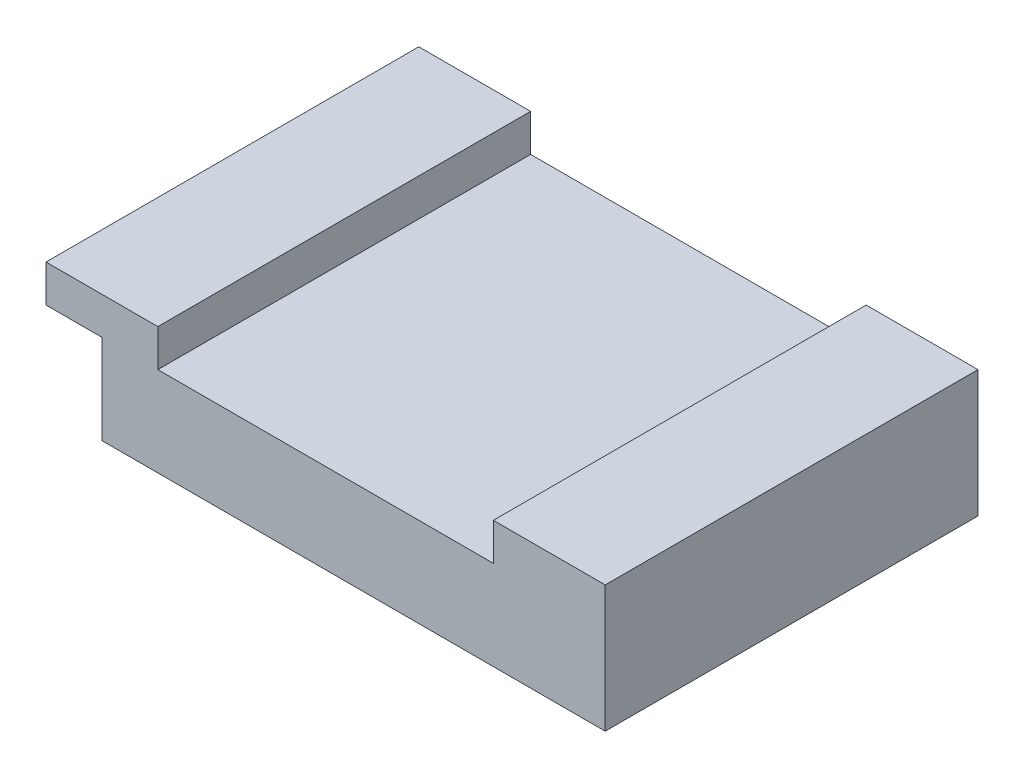
ISO-10303-21;
HEADER;
FILE_DESCRIPTION(('STEP AP214'),'2;1');
FILE_NAME('part.step','',(''),(''),'','','');
FILE_SCHEMA(('AUTOMOTIVE_DESIGN { 1 0 10303 214 1 1 1 1 }'));
ENDSEC;
DATA;
#1=APPLICATION_CONTEXT('core data for automotive mechanical design processes');
#2=APPLICATION_PROTOCOL_DEFINITION('international standard','automotive_design',2000,#1);
#3=PRODUCT_CONTEXT('',#1,'mechanical');
#4=PRODUCT('Part','Part','',(#3));
#5=PRODUCT_RELATED_PRODUCT_CATEGORY('part','',(#4));
#6=PRODUCT_DEFINITION_FORMATION('','',#4);
#7=PRODUCT_DEFINITION_CONTEXT('part definition',#1,'design');
#8=PRODUCT_DEFINITION('design','',#6,#7);
#9=PRODUCT_DEFINITION_SHAPE('','',#8);
#10=(LENGTH_UNIT() NAMED_UNIT(*) SI_UNIT(.MILLI.,.METRE.));
#11=(NAMED_UNIT(*) PLANE_ANGLE_UNIT() SI_UNIT($,.RADIAN.));
#12=(NAMED_UNIT(*) SI_UNIT($,.STERADIAN.) SOLID_ANGLE_UNIT());
#13=UNCERTAINTY_MEASURE_WITH_UNIT(LENGTH_MEASURE(1.E-05),#10,'distance_accuracy_value','');
#14=(GEOMETRIC_REPRESENTATION_CONTEXT(3) GLOBAL_UNCERTAINTY_ASSIGNED_CONTEXT((#13)) GLOBAL_UNIT_ASSIGNED_CONTEXT((#10,
#11,#12)) REPRESENTATION_CONTEXT('',''));
#15=CARTESIAN_POINT('',(0.,0.,0.));
#16=DIRECTION('',(0.,0.,1.));
#17=DIRECTION('',(1.,0.,0.));
#18=AXIS2_PLACEMENT_3D('',#15,#16,#17);
#19=CARTESIAN_POINT('',(75.,0.,50.));
#20=DIRECTION('',(0.,-1.,0.));
#21=DIRECTION('',(0.,0.,-1.));
#22=AXIS2_PLACEMENT_3D('',#19,#20,#21);
#23=PLANE('',#22);
#24=DIRECTION('',(0.,0.,1.));
#25=VECTOR('',#24,1.);
#26=CARTESIAN_POINT('',(60.,0.,0.));
#27=LINE('',#26,#25);
#28=CARTESIAN_POINT('',(60.,0.,0.));
#29=VERTEX_POINT('',#28);
#30=CARTESIAN_POINT('',(60.,0.,50.));
#31=VERTEX_POINT('',#30);
#32=EDGE_CURVE('E148',#29,#31,#27,.T.);
#33=ORIENTED_EDGE('',*,*,#32,.F.);
#34=DIRECTION('',(-1.,0.,0.));
#35=VECTOR('',#34,1.);
#36=CARTESIAN_POINT('',(75.,0.,0.));
#37=LINE('',#36,#35);
#38=CARTESIAN_POINT('',(15.,0.,0.));
#39=VERTEX_POINT('',#38);
#40=EDGE_CURVE('E55',#29,#39,#37,.T.);
#41=ORIENTED_EDGE('',*,*,#40,.T.);
#42=DIRECTION('',(0.,0.,1.));
#43=VECTOR('',#42,1.);
#44=CARTESIAN_POINT('',(15.,0.,50.));
#45=LINE('',#44,#43);
#46=CARTESIAN_POINT('',(15.,0.,50.));
#47=VERTEX_POINT('',#46);
#48=EDGE_CURVE('E163',#39,#47,#45,.T.);
#49=ORIENTED_EDGE('',*,*,#48,.T.);
#50=DIRECTION('',(-1.,0.,0.));
#51=VECTOR('',#50,1.);
#52=CARTESIAN_POINT('',(75.,0.,50.));
#53=LINE('',#52,#51);
#54=EDGE_CURVE('E131',#31,#47,#53,.T.);
#55=ORIENTED_EDGE('',*,*,#54,.F.);
#56=EDGE_LOOP('',(#33,#41,#49,#55));
#57=FACE_BOUND('',#56,.T.);
#58=ADVANCED_FACE('F39',(#57),#23,.F.);
#59=CARTESIAN_POINT('',(15.,0.,50.));
#60=DIRECTION('',(-1.,0.,0.));
#61=DIRECTION('',(0.,0.,1.));
#62=AXIS2_PLACEMENT_3D('',#59,#60,#61);
#63=PLANE('',#62);
#64=ORIENTED_EDGE('',*,*,#48,.F.);
#65=DIRECTION('',(0.,1.,0.));
#66=VECTOR('',#65,1.);
#67=CARTESIAN_POINT('',(15.,0.,0.));
#68=LINE('',#67,#66);
#69=CARTESIAN_POINT('',(15.,5.,0.));
#70=VERTEX_POINT('',#69);
#71=EDGE_CURVE('E216',#39,#70,#68,.T.);
#72=ORIENTED_EDGE('',*,*,#71,.T.);
#73=DIRECTION('',(0.,0.,-1.));
#74=VECTOR('',#73,1.);
#75=CARTESIAN_POINT('',(15.,5.,50.));
#76=LINE('',#75,#74);
#77=CARTESIAN_POINT('',(15.,5.,50.));
#78=VERTEX_POINT('',#77);
#79=EDGE_CURVE('E48',#78,#70,#76,.T.);
#80=ORIENTED_EDGE('',*,*,#79,.F.);
#81=DIRECTION('',(0.,1.,0.));
#82=VECTOR('',#81,1.);
#83=CARTESIAN_POINT('',(15.,0.,50.));
#84=LINE('',#83,#82);
#85=EDGE_CURVE('E203',#47,#78,#84,.T.);
#86=ORIENTED_EDGE('',*,*,#85,.F.);
#87=EDGE_LOOP('',(#64,#72,#80,#86));
#88=FACE_BOUND('',#87,.T.);
#89=ADVANCED_FACE('F241',(#88),#63,.F.);
#90=CARTESIAN_POINT('',(0.,0.,50.));
#91=DIRECTION('',(0.,1.,0.));
#92=DIRECTION('',(0.,0.,1.));
#93=AXIS2_PLACEMENT_3D('',#90,#91,#92);
#94=PLANE('',#93);
#95=DIRECTION('',(0.,0.,-1.));
#96=VECTOR('',#95,1.);
#97=CARTESIAN_POINT('',(7.49999999999999,0.,50.));
#98=LINE('',#97,#96);
#99=CARTESIAN_POINT('',(7.5,0.,50.));
#100=VERTEX_POINT('',#99);
#101=CARTESIAN_POINT('',(7.5,0.,0.));
#102=VERTEX_POINT('',#101);
#103=EDGE_CURVE('E63',#100,#102,#98,.T.);
#104=ORIENTED_EDGE('',*,*,#103,.F.);
#105=DIRECTION('',(1.,0.,0.));
#106=VECTOR('',#105,1.);
#107=CARTESIAN_POINT('',(0.,0.,50.));
#108=LINE('',#107,#106);
#109=CARTESIAN_POINT('',(0.,0.,50.));
#110=VERTEX_POINT('',#109);
#111=EDGE_CURVE('E199',#110,#100,#108,.T.);
#112=ORIENTED_EDGE('',*,*,#111,.F.);
#113=DIRECTION('',(0.,0.,-1.));
#114=VECTOR('',#113,1.);
#115=CARTESIAN_POINT('',(0.,0.,50.));
#116=LINE('',#115,#114);
#117=CARTESIAN_POINT('',(0.,0.,0.));
#118=VERTEX_POINT('',#117);
#119=EDGE_CURVE('E11',#110,#118,#116,.T.);
#120=ORIENTED_EDGE('',*,*,#119,.T.);
#121=DIRECTION('',(1.,0.,0.));
#122=VECTOR('',#121,1.);
#123=CARTESIAN_POINT('',(0.,0.,0.));
#124=LINE('',#123,#122);
#125=EDGE_CURVE('E213',#118,#102,#124,.T.);
#126=ORIENTED_EDGE('',*,*,#125,.T.);
#127=EDGE_LOOP('',(#104,#112,#120,#126));
#128=FACE_BOUND('',#127,.T.);
#129=ADVANCED_FACE('F265',(#128),#94,.F.);
#130=CARTESIAN_POINT('',(0.,0.,50.));
#131=DIRECTION('',(1.,0.,0.));
#132=DIRECTION('',(0.,0.,-1.));
#133=AXIS2_PLACEMENT_3D('',#130,#131,#132);
#134=PLANE('',#133);
#135=DIRECTION('',(0.,-1.,0.));
#136=VECTOR('',#135,1.);
#137=CARTESIAN_POINT('',(0.,0.,0.));
#138=LINE('',#137,#136);
#139=CARTESIAN_POINT('',(0.,5.,0.));
#140=VERTEX_POINT('',#139);
#141=EDGE_CURVE('E194',#140,#118,#138,.T.);
#142=ORIENTED_EDGE('',*,*,#141,.T.);
#143=ORIENTED_EDGE('',*,*,#119,.F.);
#144=DIRECTION('',(0.,-1.,0.));
#145=VECTOR('',#144,1.);
#146=CARTESIAN_POINT('',(0.,0.,50.));
#147=LINE('',#146,#145);
#148=CARTESIAN_POINT('',(0.,5.,50.));
#149=VERTEX_POINT('',#148);
#150=EDGE_CURVE('E195',#149,#110,#147,.T.);
#151=ORIENTED_EDGE('',*,*,#150,.F.);
#152=DIRECTION('',(0.,0.,-1.));
#153=VECTOR('',#152,1.);
#154=CARTESIAN_POINT('',(0.,5.,50.));
#155=LINE('',#154,#153);
#156=EDGE_CURVE('E209',#149,#140,#155,.T.);
#157=ORIENTED_EDGE('',*,*,#156,.T.);
#158=EDGE_LOOP('',(#142,#143,#151,#157));
#159=FACE_BOUND('',#158,.T.);
#160=ADVANCED_FACE('F41',(#159),#134,.F.);
#161=CARTESIAN_POINT('',(0.,5.,50.));
#162=DIRECTION('',(0.,-1.,0.));
#163=DIRECTION('',(0.,0.,-1.));
#164=AXIS2_PLACEMENT_3D('',#161,#162,#163);
#165=PLANE('',#164);
#166=DIRECTION('',(-1.,0.,0.));
#167=VECTOR('',#166,1.);
#168=CARTESIAN_POINT('',(0.,5.,0.));
#169=LINE('',#168,#167);
#170=EDGE_CURVE('E200',#70,#140,#169,.T.);
#171=ORIENTED_EDGE('',*,*,#170,.T.);
#172=ORIENTED_EDGE('',*,*,#156,.F.);
#173=DIRECTION('',(-1.,0.,0.));
#174=VECTOR('',#173,1.);
#175=CARTESIAN_POINT('',(0.,5.,50.));
#176=LINE('',#175,#174);
#177=EDGE_CURVE('E206',#78,#149,#176,.T.);
#178=ORIENTED_EDGE('',*,*,#177,.F.);
#179=ORIENTED_EDGE('',*,*,#79,.T.);
#180=EDGE_LOOP('',(#171,#172,#178,#179));
#181=FACE_BOUND('',#180,.T.);
#182=ADVANCED_FACE('F229',(#181),#165,.F.);
#183=CARTESIAN_POINT('',(0.,0.,50.));
#184=DIRECTION('',(0.,0.,-1.));
#185=DIRECTION('',(-1.,0.,0.));
#186=AXIS2_PLACEMENT_3D('',#183,#184,#185);
#187=PLANE('',#186);
#188=ORIENTED_EDGE('',*,*,#150,.T.);
#189=ORIENTED_EDGE('',*,*,#111,.T.);
#190=DIRECTION('',(0.,1.,0.));
#191=VECTOR('',#190,1.);
#192=CARTESIAN_POINT('',(7.49999999999999,-12.,50.));
#193=LINE('',#192,#191);
#194=CARTESIAN_POINT('',(7.49999999999999,-12.,50.));
#195=VERTEX_POINT('',#194);
#196=EDGE_CURVE('E190',#195,#100,#193,.T.);
#197=ORIENTED_EDGE('',*,*,#196,.F.);
#198=DIRECTION('',(-1.,0.,0.));
#199=VECTOR('',#198,1.);
#200=CARTESIAN_POINT('',(15.,-12.,50.));
#201=LINE('',#200,#199);
#202=CARTESIAN_POINT('',(75.,-12.,50.));
#203=VERTEX_POINT('',#202);
#204=EDGE_CURVE('E175',#203,#195,#201,.T.);
#205=ORIENTED_EDGE('',*,*,#204,.F.);
#206=DIRECTION('',(0.,-1.,0.));
#207=VECTOR('',#206,1.);
#208=CARTESIAN_POINT('',(75.,-12.,50.));
#209=LINE('',#208,#207);
#210=CARTESIAN_POINT('',(75.,5.,50.));
#211=VERTEX_POINT('',#210);
#212=EDGE_CURVE('E164',#211,#203,#209,.T.);
#213=ORIENTED_EDGE('',*,*,#212,.F.);
#214=DIRECTION('',(1.,0.,0.));
#215=VECTOR('',#214,1.);
#216=CARTESIAN_POINT('',(75.,5.,50.));
#217=LINE('',#216,#215);
#218=CARTESIAN_POINT('',(60.,5.,50.));
#219=VERTEX_POINT('',#218);
#220=EDGE_CURVE('E146',#219,#211,#217,.T.);
#221=ORIENTED_EDGE('',*,*,#220,.F.);
#222=DIRECTION('',(0.,-1.,0.));
#223=VECTOR('',#222,1.);
#224=CARTESIAN_POINT('',(60.,5.,50.));
#225=LINE('',#224,#223);
#226=EDGE_CURVE('E156',#219,#31,#225,.T.);
#227=ORIENTED_EDGE('',*,*,#226,.T.);
#228=ORIENTED_EDGE('',*,*,#54,.T.);
#229=ORIENTED_EDGE('',*,*,#85,.T.);
#230=ORIENTED_EDGE('',*,*,#177,.T.);
#231=EDGE_LOOP('',(#188,#189,#197,#205,#213,#221,#227,#228,#229,#230));
#232=FACE_BOUND('',#231,.T.);
#233=ADVANCED_FACE('F238',(#232),#187,.F.);
#234=CARTESIAN_POINT('',(0.,0.,0.));
#235=DIRECTION('',(0.,0.,-1.));
#236=DIRECTION('',(-1.,0.,0.));
#237=AXIS2_PLACEMENT_3D('',#234,#235,#236);
#238=PLANE('',#237);
#239=ORIENTED_EDGE('',*,*,#141,.F.);
#240=ORIENTED_EDGE('',*,*,#170,.F.);
#241=ORIENTED_EDGE('',*,*,#71,.F.);
#242=ORIENTED_EDGE('',*,*,#40,.F.);
#243=DIRECTION('',(0.,-1.,0.));
#244=VECTOR('',#243,1.);
#245=CARTESIAN_POINT('',(60.,5.,0.));
#246=LINE('',#245,#244);
#247=CARTESIAN_POINT('',(60.,5.,0.));
#248=VERTEX_POINT('',#247);
#249=EDGE_CURVE('E137',#248,#29,#246,.T.);
#250=ORIENTED_EDGE('',*,*,#249,.F.);
#251=DIRECTION('',(-1.,0.,0.));
#252=VECTOR('',#251,1.);
#253=CARTESIAN_POINT('',(75.,5.,0.));
#254=LINE('',#253,#252);
#255=CARTESIAN_POINT('',(75.,5.,0.));
#256=VERTEX_POINT('',#255);
#257=EDGE_CURVE('E134',#256,#248,#254,.T.);
#258=ORIENTED_EDGE('',*,*,#257,.F.);
#259=DIRECTION('',(0.,1.,0.));
#260=VECTOR('',#259,1.);
#261=CARTESIAN_POINT('',(75.,-12.,0.));
#262=LINE('',#261,#260);
#263=CARTESIAN_POINT('',(75.,-12.,0.));
#264=VERTEX_POINT('',#263);
#265=EDGE_CURVE('E120',#264,#256,#262,.T.);
#266=ORIENTED_EDGE('',*,*,#265,.F.);
#267=DIRECTION('',(1.,0.,0.));
#268=VECTOR('',#267,1.);
#269=CARTESIAN_POINT('',(15.,-12.,0.));
#270=LINE('',#269,#268);
#271=CARTESIAN_POINT('',(7.5,-12.,0.));
#272=VERTEX_POINT('',#271);
#273=EDGE_CURVE('E181',#272,#264,#270,.T.);
#274=ORIENTED_EDGE('',*,*,#273,.F.);
#275=DIRECTION('',(0.,1.,0.));
#276=VECTOR('',#275,1.);
#277=CARTESIAN_POINT('',(7.5,-12.,0.));
#278=LINE('',#277,#276);
#279=EDGE_CURVE('E184',#272,#102,#278,.T.);
#280=ORIENTED_EDGE('',*,*,#279,.T.);
#281=ORIENTED_EDGE('',*,*,#125,.F.);
#282=EDGE_LOOP('',(#239,#240,#241,#242,#250,#258,#266,#274,#280,#281));
#283=FACE_BOUND('',#282,.T.);
#284=ADVANCED_FACE('F136',(#283),#238,.T.);
#285=CARTESIAN_POINT('',(7.49999999999999,-12.,50.));
#286=DIRECTION('',(1.,0.,0.));
#287=DIRECTION('',(0.,0.,-1.));
#288=AXIS2_PLACEMENT_3D('',#285,#286,#287);
#289=PLANE('',#288);
#290=ORIENTED_EDGE('',*,*,#103,.T.);
#291=ORIENTED_EDGE('',*,*,#279,.F.);
#292=DIRECTION('',(0.,0.,-1.));
#293=VECTOR('',#292,1.);
#294=CARTESIAN_POINT('',(7.49999999999999,-12.,50.));
#295=LINE('',#294,#293);
#296=EDGE_CURVE('E178',#195,#272,#295,.T.);
#297=ORIENTED_EDGE('',*,*,#296,.F.);
#298=ORIENTED_EDGE('',*,*,#196,.T.);
#299=EDGE_LOOP('',(#290,#291,#297,#298));
#300=FACE_BOUND('',#299,.T.);
#301=ADVANCED_FACE('F250',(#300),#289,.F.);
#302=CARTESIAN_POINT('',(0.,-12.,0.));
#303=DIRECTION('',(0.,1.,0.));
#304=DIRECTION('',(0.,0.,1.));
#305=AXIS2_PLACEMENT_3D('',#302,#303,#304);
#306=PLANE('',#305);
#307=ORIENTED_EDGE('',*,*,#273,.T.);
#308=DIRECTION('',(0.,0.,-1.));
#309=VECTOR('',#308,1.);
#310=CARTESIAN_POINT('',(75.,-12.,50.));
#311=LINE('',#310,#309);
#312=EDGE_CURVE('E127',#203,#264,#311,.T.);
#313=ORIENTED_EDGE('',*,*,#312,.F.);
#314=ORIENTED_EDGE('',*,*,#204,.T.);
#315=ORIENTED_EDGE('',*,*,#296,.T.);
#316=EDGE_LOOP('',(#307,#313,#314,#315));
#317=FACE_BOUND('',#316,.T.);
#318=ADVANCED_FACE('F247',(#317),#306,.F.);
#319=CARTESIAN_POINT('',(75.,0.,0.));
#320=DIRECTION('',(-1.,0.,0.));
#321=DIRECTION('',(0.,0.,1.));
#322=AXIS2_PLACEMENT_3D('',#319,#320,#321);
#323=PLANE('',#322);
#324=ORIENTED_EDGE('',*,*,#212,.T.);
#325=ORIENTED_EDGE('',*,*,#312,.T.);
#326=ORIENTED_EDGE('',*,*,#265,.T.);
#327=DIRECTION('',(0.,0.,-1.));
#328=VECTOR('',#327,1.);
#329=CARTESIAN_POINT('',(75.,5.,0.));
#330=LINE('',#329,#328);
#331=EDGE_CURVE('E125',#211,#256,#330,.T.);
#332=ORIENTED_EDGE('',*,*,#331,.F.);
#333=EDGE_LOOP('',(#324,#325,#326,#332));
#334=FACE_BOUND('',#333,.T.);
#335=ADVANCED_FACE('F123',(#334),#323,.F.);
#336=CARTESIAN_POINT('',(60.,5.,0.));
#337=DIRECTION('',(1.,0.,0.));
#338=DIRECTION('',(0.,0.,-1.));
#339=AXIS2_PLACEMENT_3D('',#336,#337,#338);
#340=PLANE('',#339);
#341=ORIENTED_EDGE('',*,*,#32,.T.);
#342=ORIENTED_EDGE('',*,*,#226,.F.);
#343=DIRECTION('',(0.,0.,1.));
#344=VECTOR('',#343,1.);
#345=CARTESIAN_POINT('',(60.,5.,0.));
#346=LINE('',#345,#344);
#347=EDGE_CURVE('E141',#248,#219,#346,.T.);
#348=ORIENTED_EDGE('',*,*,#347,.F.);
#349=ORIENTED_EDGE('',*,*,#249,.T.);
#350=EDGE_LOOP('',(#341,#342,#348,#349));
#351=FACE_BOUND('',#350,.T.);
#352=ADVANCED_FACE('F244',(#351),#340,.F.);
#353=CARTESIAN_POINT('',(0.,5.,0.));
#354=DIRECTION('',(0.,-1.,0.));
#355=DIRECTION('',(0.,0.,-1.));
#356=AXIS2_PLACEMENT_3D('',#353,#354,#355);
#357=PLANE('',#356);
#358=ORIENTED_EDGE('',*,*,#331,.T.);
#359=ORIENTED_EDGE('',*,*,#257,.T.);
#360=ORIENTED_EDGE('',*,*,#347,.T.);
#361=ORIENTED_EDGE('',*,*,#220,.T.);
#362=EDGE_LOOP('',(#358,#359,#360,#361));
#363=FACE_BOUND('',#362,.T.);
#364=ADVANCED_FACE('F144',(#363),#357,.F.);
#365=CLOSED_SHELL('',(#58,#89,#129,#160,#182,#233,#284,#301,#318,#335,#352,#364));
#366=MANIFOLD_SOLID_BREP('B2',#365);
#367=ADVANCED_BREP_SHAPE_REPRESENTATION('',(#18,#366),#14);
#368=SHAPE_DEFINITION_REPRESENTATION(#9,#367);
ENDSEC;
END-ISO-10303-21;
